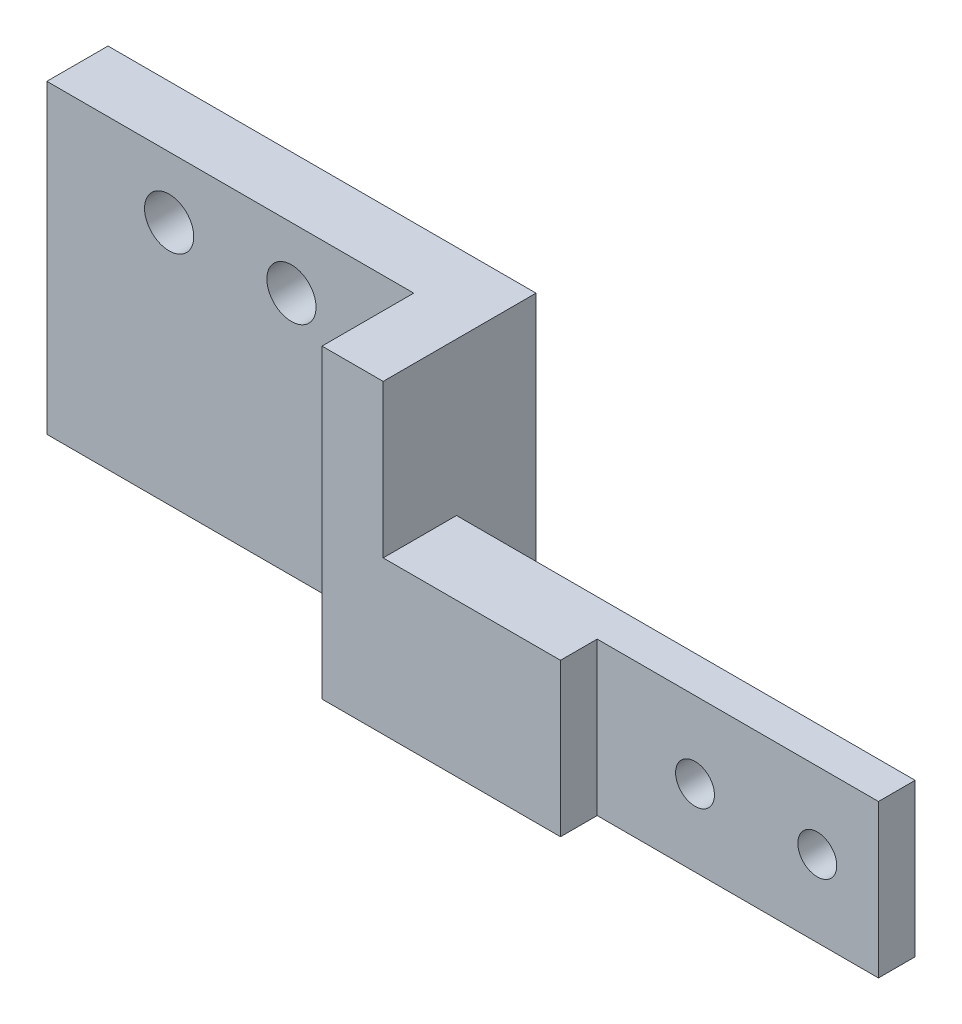
ISO-10303-21;
HEADER;
FILE_DESCRIPTION(('STEP AP214'),'2;1');
FILE_NAME('part.step','',(''),(''),'','','');
FILE_SCHEMA(('AUTOMOTIVE_DESIGN { 1 0 10303 214 1 1 1 1 }'));
ENDSEC;
DATA;
#1=APPLICATION_CONTEXT('core data for automotive mechanical design processes');
#2=APPLICATION_PROTOCOL_DEFINITION('international standard','automotive_design',2000,#1);
#3=PRODUCT_CONTEXT('',#1,'mechanical');
#4=PRODUCT('Part','Part','',(#3));
#5=PRODUCT_RELATED_PRODUCT_CATEGORY('part','',(#4));
#6=PRODUCT_DEFINITION_FORMATION('','',#4);
#7=PRODUCT_DEFINITION_CONTEXT('part definition',#1,'design');
#8=PRODUCT_DEFINITION('design','',#6,#7);
#9=PRODUCT_DEFINITION_SHAPE('','',#8);
#10=(LENGTH_UNIT() NAMED_UNIT(*) SI_UNIT(.MILLI.,.METRE.));
#11=(NAMED_UNIT(*) PLANE_ANGLE_UNIT() SI_UNIT($,.RADIAN.));
#12=(NAMED_UNIT(*) SI_UNIT($,.STERADIAN.) SOLID_ANGLE_UNIT());
#13=UNCERTAINTY_MEASURE_WITH_UNIT(LENGTH_MEASURE(1.E-05),#10,'distance_accuracy_value','');
#14=(GEOMETRIC_REPRESENTATION_CONTEXT(3) GLOBAL_UNCERTAINTY_ASSIGNED_CONTEXT((#13)) GLOBAL_UNIT_ASSIGNED_CONTEXT((#10,
#11,#12)) REPRESENTATION_CONTEXT('',''));
#15=CARTESIAN_POINT('',(0.,0.,0.));
#16=DIRECTION('',(0.,0.,1.));
#17=DIRECTION('',(1.,0.,0.));
#18=AXIS2_PLACEMENT_3D('',#15,#16,#17);
#19=CARTESIAN_POINT('',(46.0375,0.,-7.9385));
#20=DIRECTION('',(0.,-1.,0.));
#21=DIRECTION('',(1.,0.,0.));
#22=AXIS2_PLACEMENT_3D('',#19,#20,#21);
#23=PLANE('',#22);
#24=DIRECTION('',(0.,0.,1.));
#25=VECTOR('',#24,1.);
#26=CARTESIAN_POINT('',(-1.58749999999999,0.,-7.9385));
#27=LINE('',#26,#25);
#28=CARTESIAN_POINT('',(-1.58749999999999,0.,0.317500000000009));
#29=VERTEX_POINT('',#28);
#30=CARTESIAN_POINT('',(-1.58749999999999,0.,7.93750000000001));
#31=VERTEX_POINT('',#30);
#32=EDGE_CURVE('E126',#29,#31,#27,.T.);
#33=ORIENTED_EDGE('',*,*,#32,.T.);
#34=DIRECTION('',(-1.,0.,0.));
#35=VECTOR('',#34,1.);
#36=CARTESIAN_POINT('',(-7.93749999999999,0.,7.93750000000001));
#37=LINE('',#36,#35);
#38=CARTESIAN_POINT('',(16.8275,0.,7.93750000000001));
#39=VERTEX_POINT('',#38);
#40=EDGE_CURVE('E130',#39,#31,#37,.T.);
#41=ORIENTED_EDGE('',*,*,#40,.F.);
#42=DIRECTION('',(0.,0.,-1.));
#43=VECTOR('',#42,1.);
#44=CARTESIAN_POINT('',(16.8275,0.,7.93750000000001));
#45=LINE('',#44,#43);
#46=CARTESIAN_POINT('',(16.8275,0.,4.12750000000001));
#47=VERTEX_POINT('',#46);
#48=EDGE_CURVE('E154',#39,#47,#45,.T.);
#49=ORIENTED_EDGE('',*,*,#48,.T.);
#50=DIRECTION('',(-1.,0.,0.));
#51=VECTOR('',#50,1.);
#52=CARTESIAN_POINT('',(46.0375,0.,4.1275));
#53=LINE('',#52,#51);
#54=CARTESIAN_POINT('',(46.0375,0.,4.1275));
#55=VERTEX_POINT('',#54);
#56=EDGE_CURVE('E231',#55,#47,#53,.T.);
#57=ORIENTED_EDGE('',*,*,#56,.F.);
#58=DIRECTION('',(0.,0.,1.));
#59=VECTOR('',#58,1.);
#60=CARTESIAN_POINT('',(46.0375,0.,-7.9385));
#61=LINE('',#60,#59);
#62=CARTESIAN_POINT('',(46.0375,0.,0.317500000000002));
#63=VERTEX_POINT('',#62);
#64=EDGE_CURVE('E136',#63,#55,#61,.T.);
#65=ORIENTED_EDGE('',*,*,#64,.F.);
#66=DIRECTION('',(1.,0.,0.));
#67=VECTOR('',#66,1.);
#68=CARTESIAN_POINT('',(46.0375,0.,0.317500000000002));
#69=LINE('',#68,#67);
#70=EDGE_CURVE('E132',#29,#63,#69,.T.);
#71=ORIENTED_EDGE('',*,*,#70,.F.);
#72=EDGE_LOOP('',(#33,#41,#49,#57,#65,#71));
#73=FACE_BOUND('',#72,.T.);
#74=ADVANCED_FACE('F38',(#73),#23,.F.);
#75=CARTESIAN_POINT('',(46.0375,-15.876,4.1275));
#76=DIRECTION('',(0.,0.,-1.));
#77=DIRECTION('',(-1.,0.,0.));
#78=AXIS2_PLACEMENT_3D('',#75,#76,#77);
#79=PLANE('',#78);
#80=CARTESIAN_POINT('',(26.9875,-7.9375,4.12750000000001));
#81=DIRECTION('',(0.,0.,1.));
#82=DIRECTION('',(1.,0.,0.));
#83=AXIS2_PLACEMENT_3D('',#80,#81,#82);
#84=CIRCLE('',#83,2.0193);
#85=CARTESIAN_POINT('',(29.0068,-7.9375,4.12750000000001));
#86=VERTEX_POINT('',#85);
#87=EDGE_CURVE('E196',#86,#86,#84,.T.);
#88=ORIENTED_EDGE('',*,*,#87,.F.);
#89=EDGE_LOOP('',(#88));
#90=FACE_BOUND('',#89,.T.);
#91=CARTESIAN_POINT('',(39.6875,-7.9375,4.12750000000001));
#92=DIRECTION('',(0.,0.,1.));
#93=DIRECTION('',(1.,0.,0.));
#94=AXIS2_PLACEMENT_3D('',#91,#92,#93);
#95=CIRCLE('',#94,2.0193);
#96=CARTESIAN_POINT('',(41.7068,-7.9375,4.12750000000001));
#97=VERTEX_POINT('',#96);
#98=EDGE_CURVE('E167',#97,#97,#95,.T.);
#99=ORIENTED_EDGE('',*,*,#98,.F.);
#100=EDGE_LOOP('',(#99));
#101=FACE_BOUND('',#100,.T.);
#102=DIRECTION('',(0.,1.,0.));
#103=VECTOR('',#102,1.);
#104=CARTESIAN_POINT('',(16.8275,0.,4.12750000000001));
#105=LINE('',#104,#103);
#106=CARTESIAN_POINT('',(16.8275,-15.875,4.12750000000001));
#107=VERTEX_POINT('',#106);
#108=EDGE_CURVE('E56',#107,#47,#105,.T.);
#109=ORIENTED_EDGE('',*,*,#108,.F.);
#110=DIRECTION('',(-1.,0.,0.));
#111=VECTOR('',#110,1.);
#112=CARTESIAN_POINT('',(46.0375,-15.875,4.1275));
#113=LINE('',#112,#111);
#114=CARTESIAN_POINT('',(46.0375,-15.875,4.12750000000001));
#115=VERTEX_POINT('',#114);
#116=EDGE_CURVE('E173',#115,#107,#113,.T.);
#117=ORIENTED_EDGE('',*,*,#116,.F.);
#118=DIRECTION('',(0.,1.,0.));
#119=VECTOR('',#118,1.);
#120=CARTESIAN_POINT('',(46.0375,-15.876,4.1275));
#121=LINE('',#120,#119);
#122=EDGE_CURVE('E234',#115,#55,#121,.T.);
#123=ORIENTED_EDGE('',*,*,#122,.T.);
#124=ORIENTED_EDGE('',*,*,#56,.T.);
#125=EDGE_LOOP('',(#109,#117,#123,#124));
#126=FACE_BOUND('',#125,.T.);
#127=ADVANCED_FACE('F292',(#90,#101,#126),#79,.F.);
#128=CARTESIAN_POINT('',(46.0375,15.875,7.9375));
#129=DIRECTION('',(-1.,0.,0.));
#130=DIRECTION('',(0.,0.,1.));
#131=AXIS2_PLACEMENT_3D('',#128,#129,#130);
#132=PLANE('',#131);
#133=ORIENTED_EDGE('',*,*,#64,.T.);
#134=ORIENTED_EDGE('',*,*,#122,.F.);
#135=DIRECTION('',(0.,0.,-1.));
#136=VECTOR('',#135,1.);
#137=CARTESIAN_POINT('',(46.0375,-15.875,7.9375));
#138=LINE('',#137,#136);
#139=CARTESIAN_POINT('',(46.0375,-15.875,0.317500000000005));
#140=VERTEX_POINT('',#139);
#141=EDGE_CURVE('E247',#115,#140,#138,.T.);
#142=ORIENTED_EDGE('',*,*,#141,.T.);
#143=DIRECTION('',(0.,1.,0.));
#144=VECTOR('',#143,1.);
#145=CARTESIAN_POINT('',(46.0375,-15.876,0.317500000000002));
#146=LINE('',#145,#144);
#147=EDGE_CURVE('E269',#140,#63,#146,.T.);
#148=ORIENTED_EDGE('',*,*,#147,.T.);
#149=EDGE_LOOP('',(#133,#134,#142,#148));
#150=FACE_BOUND('',#149,.T.);
#151=ADVANCED_FACE('F40',(#150),#132,.F.);
#152=CARTESIAN_POINT('',(-46.0375,15.875,-7.9375));
#153=DIRECTION('',(0.,0.,1.));
#154=DIRECTION('',(1.,0.,0.));
#155=AXIS2_PLACEMENT_3D('',#152,#153,#154);
#156=PLANE('',#155);
#157=CARTESIAN_POINT('',(-33.3375,9.52499999999999,-7.9375));
#158=DIRECTION('',(0.,0.,1.));
#159=DIRECTION('',(1.,0.,0.));
#160=AXIS2_PLACEMENT_3D('',#157,#158,#159);
#161=CIRCLE('',#160,2.5527);
#162=CARTESIAN_POINT('',(-30.7848,9.52499999999999,-7.9375));
#163=VERTEX_POINT('',#162);
#164=EDGE_CURVE('E265',#163,#163,#161,.T.);
#165=ORIENTED_EDGE('',*,*,#164,.T.);
#166=EDGE_LOOP('',(#165));
#167=FACE_BOUND('',#166,.T.);
#168=CARTESIAN_POINT('',(-20.6375,9.52499999999999,-7.9375));
#169=DIRECTION('',(0.,0.,1.));
#170=DIRECTION('',(1.,0.,0.));
#171=AXIS2_PLACEMENT_3D('',#168,#169,#170);
#172=CIRCLE('',#171,2.5527);
#173=CARTESIAN_POINT('',(-18.0848,9.52499999999999,-7.9375));
#174=VERTEX_POINT('',#173);
#175=EDGE_CURVE('E261',#174,#174,#172,.T.);
#176=ORIENTED_EDGE('',*,*,#175,.T.);
#177=EDGE_LOOP('',(#176));
#178=FACE_BOUND('',#177,.T.);
#179=DIRECTION('',(0.,1.,0.));
#180=VECTOR('',#179,1.);
#181=CARTESIAN_POINT('',(-1.58749999999999,15.875,-7.9375));
#182=LINE('',#181,#180);
#183=CARTESIAN_POINT('',(-1.58749999999999,-15.875,-7.9375));
#184=VERTEX_POINT('',#183);
#185=CARTESIAN_POINT('',(-1.58749999999999,15.875,-7.9375));
#186=VERTEX_POINT('',#185);
#187=EDGE_CURVE('E256',#184,#186,#182,.T.);
#188=ORIENTED_EDGE('',*,*,#187,.F.);
#189=DIRECTION('',(-1.,0.,0.));
#190=VECTOR('',#189,1.);
#191=CARTESIAN_POINT('',(-46.0375,-15.875,-7.9375));
#192=LINE('',#191,#190);
#193=CARTESIAN_POINT('',(-46.0375,-15.875,-7.9375));
#194=VERTEX_POINT('',#193);
#195=EDGE_CURVE('E244',#184,#194,#192,.T.);
#196=ORIENTED_EDGE('',*,*,#195,.T.);
#197=DIRECTION('',(0.,-1.,0.));
#198=VECTOR('',#197,1.);
#199=CARTESIAN_POINT('',(-46.0375,15.875,-7.9375));
#200=LINE('',#199,#198);
#201=CARTESIAN_POINT('',(-46.0375,15.875,-7.9375));
#202=VERTEX_POINT('',#201);
#203=EDGE_CURVE('E11',#202,#194,#200,.T.);
#204=ORIENTED_EDGE('',*,*,#203,.F.);
#205=DIRECTION('',(-1.,0.,0.));
#206=VECTOR('',#205,1.);
#207=CARTESIAN_POINT('',(-46.0375,15.875,-7.9375));
#208=LINE('',#207,#206);
#209=EDGE_CURVE('E243',#186,#202,#208,.T.);
#210=ORIENTED_EDGE('',*,*,#209,.F.);
#211=EDGE_LOOP('',(#188,#196,#204,#210));
#212=FACE_BOUND('',#211,.T.);
#213=ADVANCED_FACE('F394',(#167,#178,#212),#156,.F.);
#214=CARTESIAN_POINT('',(-46.0375,15.875,7.9375));
#215=DIRECTION('',(1.,0.,0.));
#216=DIRECTION('',(0.,0.,-1.));
#217=AXIS2_PLACEMENT_3D('',#214,#215,#216);
#218=PLANE('',#217);
#219=DIRECTION('',(0.,0.,1.));
#220=VECTOR('',#219,1.);
#221=CARTESIAN_POINT('',(-46.0375,-15.875,7.9375));
#222=LINE('',#221,#220);
#223=CARTESIAN_POINT('',(-46.0375,-15.875,-1.5875));
#224=VERTEX_POINT('',#223);
#225=EDGE_CURVE('E239',#194,#224,#222,.T.);
#226=ORIENTED_EDGE('',*,*,#225,.T.);
#227=DIRECTION('',(0.,1.,0.));
#228=VECTOR('',#227,1.);
#229=CARTESIAN_POINT('',(-46.0375,-15.875,-1.5875));
#230=LINE('',#229,#228);
#231=CARTESIAN_POINT('',(-46.0375,15.875,-1.5875));
#232=VERTEX_POINT('',#231);
#233=EDGE_CURVE('E219',#224,#232,#230,.T.);
#234=ORIENTED_EDGE('',*,*,#233,.T.);
#235=DIRECTION('',(0.,0.,1.));
#236=VECTOR('',#235,1.);
#237=CARTESIAN_POINT('',(-46.0375,15.875,7.9375));
#238=LINE('',#237,#236);
#239=EDGE_CURVE('E48',#202,#232,#238,.T.);
#240=ORIENTED_EDGE('',*,*,#239,.F.);
#241=ORIENTED_EDGE('',*,*,#203,.T.);
#242=EDGE_LOOP('',(#226,#234,#240,#241));
#243=FACE_BOUND('',#242,.T.);
#244=ADVANCED_FACE('F307',(#243),#218,.F.);
#245=CARTESIAN_POINT('',(0.,15.875,0.));
#246=DIRECTION('',(0.,-1.,0.));
#247=DIRECTION('',(0.,0.,-1.));
#248=AXIS2_PLACEMENT_3D('',#245,#246,#247);
#249=PLANE('',#248);
#250=DIRECTION('',(0.,0.,-1.));
#251=VECTOR('',#250,1.);
#252=CARTESIAN_POINT('',(-7.93749999999999,15.875,7.9375));
#253=LINE('',#252,#251);
#254=CARTESIAN_POINT('',(-7.93749999999999,15.875,7.93750000000001));
#255=VERTEX_POINT('',#254);
#256=CARTESIAN_POINT('',(-7.93749999999999,15.875,-1.5875));
#257=VERTEX_POINT('',#256);
#258=EDGE_CURVE('E207',#255,#257,#253,.T.);
#259=ORIENTED_EDGE('',*,*,#258,.F.);
#260=DIRECTION('',(-1.,0.,0.));
#261=VECTOR('',#260,1.);
#262=CARTESIAN_POINT('',(-7.93749999999999,15.875,7.93750000000001));
#263=LINE('',#262,#261);
#264=CARTESIAN_POINT('',(-1.58749999999999,15.875,7.93750000000001));
#265=VERTEX_POINT('',#264);
#266=EDGE_CURVE('E146',#265,#255,#263,.T.);
#267=ORIENTED_EDGE('',*,*,#266,.F.);
#268=DIRECTION('',(0.,0.,1.));
#269=VECTOR('',#268,1.);
#270=CARTESIAN_POINT('',(-1.58749999999999,15.875,-7.9385));
#271=LINE('',#270,#269);
#272=EDGE_CURVE('E137',#186,#265,#271,.T.);
#273=ORIENTED_EDGE('',*,*,#272,.F.);
#274=ORIENTED_EDGE('',*,*,#209,.T.);
#275=ORIENTED_EDGE('',*,*,#239,.T.);
#276=DIRECTION('',(-1.,0.,0.));
#277=VECTOR('',#276,1.);
#278=CARTESIAN_POINT('',(-46.0375,15.875,-1.5875));
#279=LINE('',#278,#277);
#280=EDGE_CURVE('E211',#257,#232,#279,.T.);
#281=ORIENTED_EDGE('',*,*,#280,.F.);
#282=EDGE_LOOP('',(#259,#267,#273,#274,#275,#281));
#283=FACE_BOUND('',#282,.T.);
#284=ADVANCED_FACE('F299',(#283),#249,.F.);
#285=CARTESIAN_POINT('',(0.,-15.875,0.));
#286=DIRECTION('',(0.,-1.,0.));
#287=DIRECTION('',(0.,0.,-1.));
#288=AXIS2_PLACEMENT_3D('',#285,#286,#287);
#289=PLANE('',#288);
#290=ORIENTED_EDGE('',*,*,#116,.T.);
#291=DIRECTION('',(0.,0.,-1.));
#292=VECTOR('',#291,1.);
#293=CARTESIAN_POINT('',(16.8275,-15.875,7.93750000000001));
#294=LINE('',#293,#292);
#295=CARTESIAN_POINT('',(16.8275,-15.875,7.93750000000001));
#296=VERTEX_POINT('',#295);
#297=EDGE_CURVE('E158',#296,#107,#294,.T.);
#298=ORIENTED_EDGE('',*,*,#297,.F.);
#299=DIRECTION('',(1.,0.,0.));
#300=VECTOR('',#299,1.);
#301=CARTESIAN_POINT('',(-7.93749999999999,-15.875,7.93750000000001));
#302=LINE('',#301,#300);
#303=CARTESIAN_POINT('',(-7.93749999999999,-15.875,7.93750000000001));
#304=VERTEX_POINT('',#303);
#305=EDGE_CURVE('E161',#304,#296,#302,.T.);
#306=ORIENTED_EDGE('',*,*,#305,.F.);
#307=DIRECTION('',(0.,0.,-1.));
#308=VECTOR('',#307,1.);
#309=CARTESIAN_POINT('',(-7.93749999999999,-15.875,7.9375));
#310=LINE('',#309,#308);
#311=CARTESIAN_POINT('',(-7.93749999999999,-15.875,-1.5875));
#312=VERTEX_POINT('',#311);
#313=EDGE_CURVE('E64',#304,#312,#310,.T.);
#314=ORIENTED_EDGE('',*,*,#313,.T.);
#315=DIRECTION('',(-1.,0.,0.));
#316=VECTOR('',#315,1.);
#317=CARTESIAN_POINT('',(-46.0375,-15.875,-1.5875));
#318=LINE('',#317,#316);
#319=EDGE_CURVE('E210',#312,#224,#318,.T.);
#320=ORIENTED_EDGE('',*,*,#319,.T.);
#321=ORIENTED_EDGE('',*,*,#225,.F.);
#322=ORIENTED_EDGE('',*,*,#195,.F.);
#323=DIRECTION('',(0.,0.,1.));
#324=VECTOR('',#323,1.);
#325=CARTESIAN_POINT('',(-1.58749999999999,-15.875,-7.9375));
#326=LINE('',#325,#324);
#327=CARTESIAN_POINT('',(-1.58749999999999,-15.875,0.317500000000009));
#328=VERTEX_POINT('',#327);
#329=EDGE_CURVE('E281',#184,#328,#326,.T.);
#330=ORIENTED_EDGE('',*,*,#329,.T.);
#331=DIRECTION('',(1.,0.,0.));
#332=VECTOR('',#331,1.);
#333=CARTESIAN_POINT('',(46.0375,-15.875,0.317500000000002));
#334=LINE('',#333,#332);
#335=EDGE_CURVE('E277',#328,#140,#334,.T.);
#336=ORIENTED_EDGE('',*,*,#335,.T.);
#337=ORIENTED_EDGE('',*,*,#141,.F.);
#338=EDGE_LOOP('',(#290,#298,#306,#314,#320,#321,#322,#330,#336,#337));
#339=FACE_BOUND('',#338,.T.);
#340=ADVANCED_FACE('F297',(#339),#289,.T.);
#341=CARTESIAN_POINT('',(-1.58749999999999,15.875,-7.9385));
#342=DIRECTION('',(-1.,0.,0.));
#343=DIRECTION('',(0.,-1.,0.));
#344=AXIS2_PLACEMENT_3D('',#341,#342,#343);
#345=PLANE('',#344);
#346=ORIENTED_EDGE('',*,*,#272,.T.);
#347=DIRECTION('',(0.,1.,0.));
#348=VECTOR('',#347,1.);
#349=CARTESIAN_POINT('',(-1.58749999999999,15.875,7.93750000000001));
#350=LINE('',#349,#348);
#351=EDGE_CURVE('E139',#31,#265,#350,.T.);
#352=ORIENTED_EDGE('',*,*,#351,.F.);
#353=ORIENTED_EDGE('',*,*,#32,.F.);
#354=DIRECTION('',(0.,1.,0.));
#355=VECTOR('',#354,1.);
#356=CARTESIAN_POINT('',(-1.58749999999999,-15.876,0.317500000000009));
#357=LINE('',#356,#355);
#358=EDGE_CURVE('E270',#328,#29,#357,.T.);
#359=ORIENTED_EDGE('',*,*,#358,.F.);
#360=ORIENTED_EDGE('',*,*,#329,.F.);
#361=ORIENTED_EDGE('',*,*,#187,.T.);
#362=EDGE_LOOP('',(#346,#352,#353,#359,#360,#361));
#363=FACE_BOUND('',#362,.T.);
#364=ADVANCED_FACE('F140',(#363),#345,.F.);
#365=CARTESIAN_POINT('',(-20.6375,9.52499999999999,7.9375));
#366=DIRECTION('',(0.,0.,1.));
#367=DIRECTION('',(1.,0.,0.));
#368=AXIS2_PLACEMENT_3D('',#365,#366,#367);
#369=CYLINDRICAL_SURFACE('',#368,2.5527);
#370=CARTESIAN_POINT('',(-20.6375,9.52499999999999,-1.5875));
#371=DIRECTION('',(0.,0.,-1.));
#372=DIRECTION('',(-1.,0.,0.));
#373=AXIS2_PLACEMENT_3D('',#370,#371,#372);
#374=CIRCLE('',#373,2.5527);
#375=CARTESIAN_POINT('',(-23.1902,9.52499999999999,-1.5875));
#376=VERTEX_POINT('',#375);
#377=EDGE_CURVE('E227',#376,#376,#374,.F.);
#378=ORIENTED_EDGE('',*,*,#377,.T.);
#379=EDGE_LOOP('',(#378));
#380=FACE_BOUND('',#379,.T.);
#381=ORIENTED_EDGE('',*,*,#175,.F.);
#382=EDGE_LOOP('',(#381));
#383=FACE_BOUND('',#382,.T.);
#384=ADVANCED_FACE('F305',(#380,#383),#369,.F.);
#385=CARTESIAN_POINT('',(-33.3375,9.52499999999999,7.9375));
#386=DIRECTION('',(0.,0.,1.));
#387=DIRECTION('',(1.,0.,0.));
#388=AXIS2_PLACEMENT_3D('',#385,#386,#387);
#389=CYLINDRICAL_SURFACE('',#388,2.5527);
#390=CARTESIAN_POINT('',(-33.3375,9.52499999999999,-1.5875));
#391=DIRECTION('',(0.,0.,-1.));
#392=DIRECTION('',(-1.,0.,0.));
#393=AXIS2_PLACEMENT_3D('',#390,#391,#392);
#394=CIRCLE('',#393,2.5527);
#395=CARTESIAN_POINT('',(-35.8902,9.52499999999999,-1.5875));
#396=VERTEX_POINT('',#395);
#397=EDGE_CURVE('E223',#396,#396,#394,.F.);
#398=ORIENTED_EDGE('',*,*,#397,.T.);
#399=EDGE_LOOP('',(#398));
#400=FACE_BOUND('',#399,.T.);
#401=ORIENTED_EDGE('',*,*,#164,.F.);
#402=EDGE_LOOP('',(#401));
#403=FACE_BOUND('',#402,.T.);
#404=ADVANCED_FACE('F321',(#400,#403),#389,.F.);
#405=CARTESIAN_POINT('',(46.0375,-15.876,0.317500000000002));
#406=DIRECTION('',(0.,0.,1.));
#407=DIRECTION('',(1.,0.,0.));
#408=AXIS2_PLACEMENT_3D('',#405,#406,#407);
#409=PLANE('',#408);
#410=CARTESIAN_POINT('',(39.6875,-7.9375,0.317500000000003));
#411=DIRECTION('',(0.,0.,1.));
#412=DIRECTION('',(1.,0.,0.));
#413=AXIS2_PLACEMENT_3D('',#410,#411,#412);
#414=CIRCLE('',#413,2.0193);
#415=CARTESIAN_POINT('',(41.7068,-7.9375,0.317500000000003));
#416=VERTEX_POINT('',#415);
#417=EDGE_CURVE('E189',#416,#416,#414,.T.);
#418=ORIENTED_EDGE('',*,*,#417,.T.);
#419=EDGE_LOOP('',(#418));
#420=FACE_BOUND('',#419,.T.);
#421=CARTESIAN_POINT('',(26.9875,-7.9375,0.317500000000005));
#422=DIRECTION('',(0.,0.,1.));
#423=DIRECTION('',(1.,0.,0.));
#424=AXIS2_PLACEMENT_3D('',#421,#422,#423);
#425=CIRCLE('',#424,2.0193);
#426=CARTESIAN_POINT('',(29.0068,-7.9375,0.317500000000005));
#427=VERTEX_POINT('',#426);
#428=EDGE_CURVE('E202',#427,#427,#425,.T.);
#429=ORIENTED_EDGE('',*,*,#428,.T.);
#430=EDGE_LOOP('',(#429));
#431=FACE_BOUND('',#430,.T.);
#432=ORIENTED_EDGE('',*,*,#358,.T.);
#433=ORIENTED_EDGE('',*,*,#70,.T.);
#434=ORIENTED_EDGE('',*,*,#147,.F.);
#435=ORIENTED_EDGE('',*,*,#335,.F.);
#436=EDGE_LOOP('',(#432,#433,#434,#435));
#437=FACE_BOUND('',#436,.T.);
#438=ADVANCED_FACE('F296',(#420,#431,#437),#409,.F.);
#439=CARTESIAN_POINT('',(-46.0375,-15.875,-1.5875));
#440=DIRECTION('',(0.,0.,-1.));
#441=DIRECTION('',(-1.,0.,0.));
#442=AXIS2_PLACEMENT_3D('',#439,#440,#441);
#443=PLANE('',#442);
#444=ORIENTED_EDGE('',*,*,#397,.F.);
#445=EDGE_LOOP('',(#444));
#446=FACE_BOUND('',#445,.T.);
#447=ORIENTED_EDGE('',*,*,#280,.T.);
#448=ORIENTED_EDGE('',*,*,#233,.F.);
#449=ORIENTED_EDGE('',*,*,#319,.F.);
#450=DIRECTION('',(0.,1.,0.));
#451=VECTOR('',#450,1.);
#452=CARTESIAN_POINT('',(-7.93749999999999,-15.875,-1.5875));
#453=LINE('',#452,#451);
#454=EDGE_CURVE('E214',#312,#257,#453,.T.);
#455=ORIENTED_EDGE('',*,*,#454,.T.);
#456=EDGE_LOOP('',(#447,#448,#449,#455));
#457=FACE_BOUND('',#456,.T.);
#458=ORIENTED_EDGE('',*,*,#377,.F.);
#459=EDGE_LOOP('',(#458));
#460=FACE_BOUND('',#459,.T.);
#461=ADVANCED_FACE('F327',(#446,#457,#460),#443,.F.);
#462=CARTESIAN_POINT('',(-7.93749999999999,-15.875,7.9375));
#463=DIRECTION('',(1.,0.,0.));
#464=DIRECTION('',(0.,0.,-1.));
#465=AXIS2_PLACEMENT_3D('',#462,#463,#464);
#466=PLANE('',#465);
#467=ORIENTED_EDGE('',*,*,#313,.F.);
#468=DIRECTION('',(0.,-1.,0.));
#469=VECTOR('',#468,1.);
#470=CARTESIAN_POINT('',(-7.93749999999999,0.,7.93750000000001));
#471=LINE('',#470,#469);
#472=EDGE_CURVE('E172',#255,#304,#471,.T.);
#473=ORIENTED_EDGE('',*,*,#472,.F.);
#474=ORIENTED_EDGE('',*,*,#258,.T.);
#475=ORIENTED_EDGE('',*,*,#454,.F.);
#476=EDGE_LOOP('',(#467,#473,#474,#475));
#477=FACE_BOUND('',#476,.T.);
#478=ADVANCED_FACE('F329',(#477),#466,.F.);
#479=CARTESIAN_POINT('',(26.9875,-7.9375,4.12750000000001));
#480=DIRECTION('',(0.,0.,1.));
#481=DIRECTION('',(1.,0.,0.));
#482=AXIS2_PLACEMENT_3D('',#479,#480,#481);
#483=CYLINDRICAL_SURFACE('',#482,2.0193);
#484=ORIENTED_EDGE('',*,*,#428,.F.);
#485=EDGE_LOOP('',(#484));
#486=FACE_BOUND('',#485,.T.);
#487=ORIENTED_EDGE('',*,*,#87,.T.);
#488=EDGE_LOOP('',(#487));
#489=FACE_BOUND('',#488,.T.);
#490=ADVANCED_FACE('F332',(#486,#489),#483,.F.);
#491=CARTESIAN_POINT('',(39.6875,-7.9375,4.12750000000001));
#492=DIRECTION('',(0.,0.,1.));
#493=DIRECTION('',(1.,0.,0.));
#494=AXIS2_PLACEMENT_3D('',#491,#492,#493);
#495=CYLINDRICAL_SURFACE('',#494,2.0193);
#496=ORIENTED_EDGE('',*,*,#417,.F.);
#497=EDGE_LOOP('',(#496));
#498=FACE_BOUND('',#497,.T.);
#499=ORIENTED_EDGE('',*,*,#98,.T.);
#500=EDGE_LOOP('',(#499));
#501=FACE_BOUND('',#500,.T.);
#502=ADVANCED_FACE('F339',(#498,#501),#495,.F.);
#503=CARTESIAN_POINT('',(16.8275,0.,7.93750000000001));
#504=DIRECTION('',(-1.,0.,0.));
#505=DIRECTION('',(0.,-1.,0.));
#506=AXIS2_PLACEMENT_3D('',#503,#504,#505);
#507=PLANE('',#506);
#508=ORIENTED_EDGE('',*,*,#108,.T.);
#509=ORIENTED_EDGE('',*,*,#48,.F.);
#510=DIRECTION('',(0.,1.,0.));
#511=VECTOR('',#510,1.);
#512=CARTESIAN_POINT('',(16.8275,0.,7.93750000000001));
#513=LINE('',#512,#511);
#514=EDGE_CURVE('E151',#296,#39,#513,.T.);
#515=ORIENTED_EDGE('',*,*,#514,.F.);
#516=ORIENTED_EDGE('',*,*,#297,.T.);
#517=EDGE_LOOP('',(#508,#509,#515,#516));
#518=FACE_BOUND('',#517,.T.);
#519=ADVANCED_FACE('F343',(#518),#507,.F.);
#520=CARTESIAN_POINT('',(0.,0.,7.93750000000001));
#521=DIRECTION('',(0.,0.,1.));
#522=DIRECTION('',(1.,0.,0.));
#523=AXIS2_PLACEMENT_3D('',#520,#521,#522);
#524=PLANE('',#523);
#525=ORIENTED_EDGE('',*,*,#472,.T.);
#526=ORIENTED_EDGE('',*,*,#305,.T.);
#527=ORIENTED_EDGE('',*,*,#514,.T.);
#528=ORIENTED_EDGE('',*,*,#40,.T.);
#529=ORIENTED_EDGE('',*,*,#351,.T.);
#530=ORIENTED_EDGE('',*,*,#266,.T.);
#531=EDGE_LOOP('',(#525,#526,#527,#528,#529,#530));
#532=FACE_BOUND('',#531,.T.);
#533=ADVANCED_FACE('F149',(#532),#524,.T.);
#534=CLOSED_SHELL('',(#74,#127,#151,#213,#244,#284,#340,#364,#384,#404,#438,#461,#478,#490,#502,
#519,#533));
#535=MANIFOLD_SOLID_BREP('B2',#534);
#536=ADVANCED_BREP_SHAPE_REPRESENTATION('',(#18,#535),#14);
#537=SHAPE_DEFINITION_REPRESENTATION(#9,#536);
ENDSEC;
END-ISO-10303-21;
